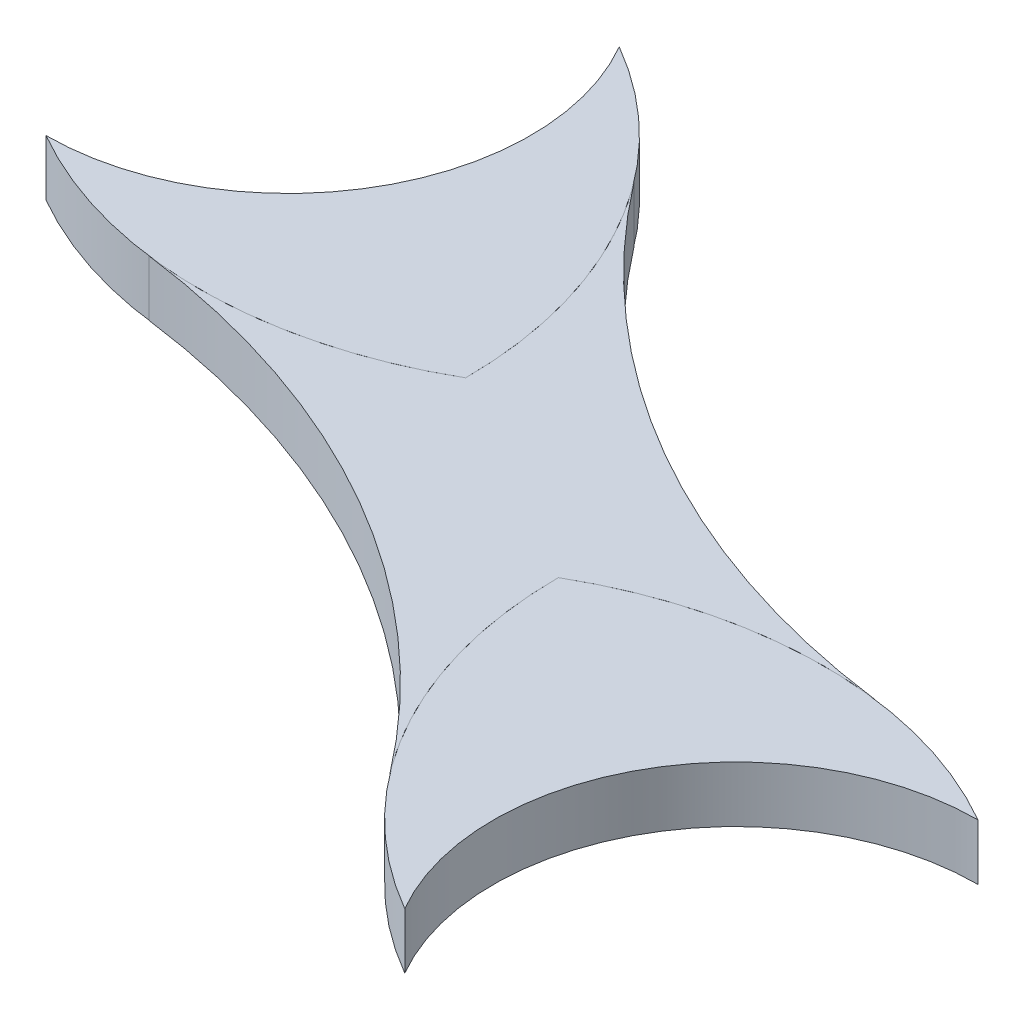
ISO-10303-21;
HEADER;
FILE_DESCRIPTION(('STEP AP214'),'2;1');
FILE_NAME('part.step','',(''),(''),'','','');
FILE_SCHEMA(('AUTOMOTIVE_DESIGN { 1 0 10303 214 1 1 1 1 }'));
ENDSEC;
DATA;
#1=APPLICATION_CONTEXT('core data for automotive mechanical design processes');
#2=APPLICATION_PROTOCOL_DEFINITION('international standard','automotive_design',2000,#1);
#3=PRODUCT_CONTEXT('',#1,'mechanical');
#4=PRODUCT('Part','Part','',(#3));
#5=PRODUCT_RELATED_PRODUCT_CATEGORY('part','',(#4));
#6=PRODUCT_DEFINITION_FORMATION('','',#4);
#7=PRODUCT_DEFINITION_CONTEXT('part definition',#1,'design');
#8=PRODUCT_DEFINITION('design','',#6,#7);
#9=PRODUCT_DEFINITION_SHAPE('','',#8);
#10=(LENGTH_UNIT() NAMED_UNIT(*) SI_UNIT(.MILLI.,.METRE.));
#11=(NAMED_UNIT(*) PLANE_ANGLE_UNIT() SI_UNIT($,.RADIAN.));
#12=(NAMED_UNIT(*) SI_UNIT($,.STERADIAN.) SOLID_ANGLE_UNIT());
#13=UNCERTAINTY_MEASURE_WITH_UNIT(LENGTH_MEASURE(1.E-05),#10,'distance_accuracy_value','');
#14=(GEOMETRIC_REPRESENTATION_CONTEXT(3) GLOBAL_UNCERTAINTY_ASSIGNED_CONTEXT((#13)) GLOBAL_UNIT_ASSIGNED_CONTEXT((#10,
#11,#12)) REPRESENTATION_CONTEXT('',''));
#15=CARTESIAN_POINT('',(0.,0.,0.));
#16=DIRECTION('',(0.,0.,1.));
#17=DIRECTION('',(1.,0.,0.));
#18=AXIS2_PLACEMENT_3D('',#15,#16,#17);
#19=CARTESIAN_POINT('',(646.423859707596,873.564193887283,1268.16700055433));
#20=DIRECTION('',(0.,1.,0.));
#21=DIRECTION('',(0.866025403784436,0.,-0.500000000000005));
#22=AXIS2_PLACEMENT_3D('',#19,#20,#21);
#23=CYLINDRICAL_SURFACE('',#22,22.5166604983954);
#24=DIRECTION('',(0.,1.,0.));
#25=VECTOR('',#24,1.);
#26=CARTESIAN_POINT('',(657.682189956793,873.564193887283,1287.66700055433));
#27=LINE('',#26,#25);
#28=CARTESIAN_POINT('',(657.682189956793,873.574193887283,1287.66700055433));
#29=VERTEX_POINT('',#28);
#30=CARTESIAN_POINT('',(657.682189956793,876.574193887283,1287.66700055433));
#31=VERTEX_POINT('',#30);
#32=EDGE_CURVE('E103',#29,#31,#27,.T.);
#33=ORIENTED_EDGE('',*,*,#32,.T.);
#34=CARTESIAN_POINT('',(646.423859707596,876.574193887283,1268.16700055433));
#35=DIRECTION('',(0.,1.,0.));
#36=DIRECTION('',(0.866025403784436,0.,-0.500000000000005));
#37=AXIS2_PLACEMENT_3D('',#34,#35,#36);
#38=CIRCLE('',#37,22.5166604983954);
#39=CARTESIAN_POINT('',(635.165529458398,876.574193887283,1287.66700055433));
#40=VERTEX_POINT('',#39);
#41=EDGE_CURVE('E79',#40,#31,#38,.T.);
#42=ORIENTED_EDGE('',*,*,#41,.F.);
#43=DIRECTION('',(0.,-1.,0.));
#44=VECTOR('',#43,1.);
#45=CARTESIAN_POINT('',(635.165529458398,876.574193887283,1287.66700055433));
#46=LINE('',#45,#44);
#47=CARTESIAN_POINT('',(635.165529458398,873.574193887283,1287.66700055433));
#48=VERTEX_POINT('',#47);
#49=EDGE_CURVE('E12',#40,#48,#46,.T.);
#50=ORIENTED_EDGE('',*,*,#49,.T.);
#51=CARTESIAN_POINT('',(646.423859707596,873.574193887283,1268.16700055433));
#52=DIRECTION('',(0.,1.,0.));
#53=DIRECTION('',(0.866025403784436,0.,-0.500000000000005));
#54=AXIS2_PLACEMENT_3D('',#51,#52,#53);
#55=CIRCLE('',#54,22.5166604983954);
#56=EDGE_CURVE('E86',#48,#29,#55,.T.);
#57=ORIENTED_EDGE('',*,*,#56,.T.);
#58=EDGE_LOOP('',(#33,#42,#50,#57));
#59=FACE_BOUND('',#58,.T.);
#60=ADVANCED_FACE('F62',(#59),#23,.T.);
#61=CARTESIAN_POINT('',(689.806545609775,873.574193887283,1243.11999517054));
#62=DIRECTION('',(0.,1.,0.));
#63=DIRECTION('',(0.866025403784436,0.,-0.500000000000005));
#64=AXIS2_PLACEMENT_3D('',#61,#62,#63);
#65=PLANE('',#64);
#66=CARTESIAN_POINT('',(635.165529458398,873.574193887283,1274.66700055433));
#67=DIRECTION('',(0.,-1.,0.));
#68=DIRECTION('',(-0.866025403784436,0.,0.500000000000005));
#69=AXIS2_PLACEMENT_3D('',#66,#67,#68);
#70=CIRCLE('',#69,13.);
#71=CARTESIAN_POINT('',(646.423859707596,873.574193887283,1268.16700055433));
#72=VERTEX_POINT('',#71);
#73=EDGE_CURVE('E104',#72,#48,#70,.T.);
#74=ORIENTED_EDGE('',*,*,#73,.F.);
#75=CARTESIAN_POINT('',(635.165529458398,873.574193887283,1287.66700055433));
#76=DIRECTION('',(0.,1.,0.));
#77=DIRECTION('',(0.866025403784436,0.,-0.500000000000005));
#78=AXIS2_PLACEMENT_3D('',#75,#76,#77);
#79=CIRCLE('',#78,22.5166604983954);
#80=EDGE_CURVE('E109',#29,#72,#79,.T.);
#81=ORIENTED_EDGE('',*,*,#80,.F.);
#82=ORIENTED_EDGE('',*,*,#56,.F.);
#83=EDGE_LOOP('',(#74,#81,#82));
#84=FACE_BOUND('',#83,.T.);
#85=ADVANCED_FACE('F64',(#84),#65,.F.);
#86=CARTESIAN_POINT('',(635.165529458398,873.564193887283,1287.66700055433));
#87=DIRECTION('',(0.,1.,0.));
#88=DIRECTION('',(0.866025403784436,0.,-0.500000000000005));
#89=AXIS2_PLACEMENT_3D('',#86,#87,#88);
#90=CYLINDRICAL_SURFACE('',#89,22.5166604983954);
#91=ORIENTED_EDGE('',*,*,#32,.F.);
#92=ORIENTED_EDGE('',*,*,#80,.T.);
#93=DIRECTION('',(0.,-1.,0.));
#94=VECTOR('',#93,1.);
#95=CARTESIAN_POINT('',(646.423859707596,876.574193887283,1268.16700055433));
#96=LINE('',#95,#94);
#97=CARTESIAN_POINT('',(646.423859707596,876.574193887283,1268.16700055433));
#98=VERTEX_POINT('',#97);
#99=EDGE_CURVE('E66',#98,#72,#96,.T.);
#100=ORIENTED_EDGE('',*,*,#99,.F.);
#101=CARTESIAN_POINT('',(635.165529458398,876.574193887283,1287.66700055433));
#102=DIRECTION('',(0.,1.,0.));
#103=DIRECTION('',(0.866025403784436,0.,-0.500000000000005));
#104=AXIS2_PLACEMENT_3D('',#101,#102,#103);
#105=CIRCLE('',#104,22.5166604983954);
#106=EDGE_CURVE('E71',#31,#98,#105,.T.);
#107=ORIENTED_EDGE('',*,*,#106,.F.);
#108=EDGE_LOOP('',(#91,#92,#100,#107));
#109=FACE_BOUND('',#108,.T.);
#110=ADVANCED_FACE('F117',(#109),#90,.T.);
#111=CARTESIAN_POINT('',(635.165529458398,861.564193887283,1274.66700055433));
#112=DIRECTION('',(0.,1.,0.));
#113=DIRECTION('',(0.866025403784436,0.,-0.500000000000005));
#114=AXIS2_PLACEMENT_3D('',#111,#112,#113);
#115=CYLINDRICAL_SURFACE('',#114,13.);
#116=ORIENTED_EDGE('',*,*,#49,.F.);
#117=CARTESIAN_POINT('',(635.165529458398,876.574193887283,1274.66700055433));
#118=DIRECTION('',(0.,1.,0.));
#119=DIRECTION('',(0.866025403784436,0.,-0.500000000000005));
#120=AXIS2_PLACEMENT_3D('',#117,#118,#119);
#121=CIRCLE('',#120,13.);
#122=EDGE_CURVE('E97',#40,#98,#121,.T.);
#123=ORIENTED_EDGE('',*,*,#122,.T.);
#124=ORIENTED_EDGE('',*,*,#99,.T.);
#125=ORIENTED_EDGE('',*,*,#73,.T.);
#126=EDGE_LOOP('',(#116,#123,#124,#125));
#127=FACE_BOUND('',#126,.T.);
#128=ADVANCED_FACE('F107',(#127),#115,.F.);
#129=CARTESIAN_POINT('',(689.806545609775,876.574193887283,1243.11999517054));
#130=DIRECTION('',(0.,1.,0.));
#131=DIRECTION('',(0.866025403784436,0.,-0.500000000000005));
#132=AXIS2_PLACEMENT_3D('',#129,#130,#131);
#133=PLANE('',#132);
#134=ORIENTED_EDGE('',*,*,#106,.T.);
#135=ORIENTED_EDGE('',*,*,#122,.F.);
#136=ORIENTED_EDGE('',*,*,#41,.T.);
#137=EDGE_LOOP('',(#134,#135,#136));
#138=FACE_BOUND('',#137,.T.);
#139=ADVANCED_FACE('F99',(#138),#133,.T.);
#140=CLOSED_SHELL('',(#60,#85,#110,#128,#139));
#141=MANIFOLD_SOLID_BREP('B2',#140);
#142=CARTESIAN_POINT('',(680.711031019824,873.564193887283,1313.9627081412));
#143=DIRECTION('',(0.,1.,0.));
#144=DIRECTION('',(-0.866025403784438,0.,0.500000000000001));
#145=AXIS2_PLACEMENT_3D('',#142,#143,#144);
#146=CYLINDRICAL_SURFACE('',#145,22.5166604983954);
#147=DIRECTION('',(0.,1.,0.));
#148=VECTOR('',#147,1.);
#149=CARTESIAN_POINT('',(669.452700770626,873.564193887283,1294.4627081412));
#150=LINE('',#149,#148);
#151=CARTESIAN_POINT('',(669.452700770626,873.574193887283,1294.4627081412));
#152=VERTEX_POINT('',#151);
#153=CARTESIAN_POINT('',(669.452700770626,876.574193887283,1294.4627081412));
#154=VERTEX_POINT('',#153);
#155=EDGE_CURVE('E261',#152,#154,#150,.T.);
#156=ORIENTED_EDGE('',*,*,#155,.T.);
#157=CARTESIAN_POINT('',(680.711031019824,876.574193887283,1313.9627081412));
#158=DIRECTION('',(0.,1.,0.));
#159=DIRECTION('',(-0.866025403784438,0.,0.500000000000001));
#160=AXIS2_PLACEMENT_3D('',#157,#158,#159);
#161=CIRCLE('',#160,22.5166604983954);
#162=CARTESIAN_POINT('',(691.969361269021,876.574193887283,1294.4627081412));
#163=VERTEX_POINT('',#162);
#164=EDGE_CURVE('E237',#163,#154,#161,.T.);
#165=ORIENTED_EDGE('',*,*,#164,.F.);
#166=DIRECTION('',(0.,-1.,0.));
#167=VECTOR('',#166,1.);
#168=CARTESIAN_POINT('',(691.969361269021,876.574193887283,1294.4627081412));
#169=LINE('',#168,#167);
#170=CARTESIAN_POINT('',(691.969361269021,873.574193887283,1294.4627081412));
#171=VERTEX_POINT('',#170);
#172=EDGE_CURVE('E60',#163,#171,#169,.T.);
#173=ORIENTED_EDGE('',*,*,#172,.T.);
#174=CARTESIAN_POINT('',(680.711031019824,873.574193887283,1313.9627081412));
#175=DIRECTION('',(0.,1.,0.));
#176=DIRECTION('',(-0.866025403784438,0.,0.500000000000001));
#177=AXIS2_PLACEMENT_3D('',#174,#175,#176);
#178=CIRCLE('',#177,22.5166604983954);
#179=EDGE_CURVE('E244',#171,#152,#178,.T.);
#180=ORIENTED_EDGE('',*,*,#179,.T.);
#181=EDGE_LOOP('',(#156,#165,#173,#180));
#182=FACE_BOUND('',#181,.T.);
#183=ADVANCED_FACE('F220',(#182),#146,.T.);
#184=CARTESIAN_POINT('',(637.328345117644,873.574193887283,1339.00971352499));
#185=DIRECTION('',(0.,1.,0.));
#186=DIRECTION('',(-0.866025403784438,0.,0.500000000000001));
#187=AXIS2_PLACEMENT_3D('',#184,#185,#186);
#188=PLANE('',#187);
#189=CARTESIAN_POINT('',(691.969361269021,873.574193887283,1307.4627081412));
#190=DIRECTION('',(0.,-1.,0.));
#191=DIRECTION('',(0.866025403784438,0.,-0.500000000000001));
#192=AXIS2_PLACEMENT_3D('',#189,#190,#191);
#193=CIRCLE('',#192,13.);
#194=CARTESIAN_POINT('',(680.711031019824,873.574193887283,1313.9627081412));
#195=VERTEX_POINT('',#194);
#196=EDGE_CURVE('E262',#195,#171,#193,.T.);
#197=ORIENTED_EDGE('',*,*,#196,.F.);
#198=CARTESIAN_POINT('',(691.969361269021,873.574193887283,1294.4627081412));
#199=DIRECTION('',(0.,1.,0.));
#200=DIRECTION('',(-0.866025403784438,0.,0.500000000000001));
#201=AXIS2_PLACEMENT_3D('',#198,#199,#200);
#202=CIRCLE('',#201,22.5166604983954);
#203=EDGE_CURVE('E267',#152,#195,#202,.T.);
#204=ORIENTED_EDGE('',*,*,#203,.F.);
#205=ORIENTED_EDGE('',*,*,#179,.F.);
#206=EDGE_LOOP('',(#197,#204,#205));
#207=FACE_BOUND('',#206,.T.);
#208=ADVANCED_FACE('F222',(#207),#188,.F.);
#209=CARTESIAN_POINT('',(691.969361269021,873.564193887283,1294.4627081412));
#210=DIRECTION('',(0.,1.,0.));
#211=DIRECTION('',(-0.866025403784438,0.,0.500000000000001));
#212=AXIS2_PLACEMENT_3D('',#209,#210,#211);
#213=CYLINDRICAL_SURFACE('',#212,22.5166604983954);
#214=ORIENTED_EDGE('',*,*,#155,.F.);
#215=ORIENTED_EDGE('',*,*,#203,.T.);
#216=DIRECTION('',(0.,-1.,0.));
#217=VECTOR('',#216,1.);
#218=CARTESIAN_POINT('',(680.711031019824,876.574193887283,1313.9627081412));
#219=LINE('',#218,#217);
#220=CARTESIAN_POINT('',(680.711031019824,876.574193887283,1313.9627081412));
#221=VERTEX_POINT('',#220);
#222=EDGE_CURVE('E224',#221,#195,#219,.T.);
#223=ORIENTED_EDGE('',*,*,#222,.F.);
#224=CARTESIAN_POINT('',(691.969361269021,876.574193887283,1294.4627081412));
#225=DIRECTION('',(0.,1.,0.));
#226=DIRECTION('',(-0.866025403784438,0.,0.500000000000001));
#227=AXIS2_PLACEMENT_3D('',#224,#225,#226);
#228=CIRCLE('',#227,22.5166604983954);
#229=EDGE_CURVE('E229',#154,#221,#228,.T.);
#230=ORIENTED_EDGE('',*,*,#229,.F.);
#231=EDGE_LOOP('',(#214,#215,#223,#230));
#232=FACE_BOUND('',#231,.T.);
#233=ADVANCED_FACE('F275',(#232),#213,.T.);
#234=CARTESIAN_POINT('',(691.969361269021,861.564193887283,1307.4627081412));
#235=DIRECTION('',(0.,1.,0.));
#236=DIRECTION('',(-0.866025403784438,0.,0.500000000000001));
#237=AXIS2_PLACEMENT_3D('',#234,#235,#236);
#238=CYLINDRICAL_SURFACE('',#237,13.);
#239=ORIENTED_EDGE('',*,*,#172,.F.);
#240=CARTESIAN_POINT('',(691.969361269021,876.574193887283,1307.4627081412));
#241=DIRECTION('',(0.,1.,0.));
#242=DIRECTION('',(-0.866025403784438,0.,0.500000000000001));
#243=AXIS2_PLACEMENT_3D('',#240,#241,#242);
#244=CIRCLE('',#243,13.);
#245=EDGE_CURVE('E255',#163,#221,#244,.T.);
#246=ORIENTED_EDGE('',*,*,#245,.T.);
#247=ORIENTED_EDGE('',*,*,#222,.T.);
#248=ORIENTED_EDGE('',*,*,#196,.T.);
#249=EDGE_LOOP('',(#239,#246,#247,#248));
#250=FACE_BOUND('',#249,.T.);
#251=ADVANCED_FACE('F265',(#250),#238,.F.);
#252=CARTESIAN_POINT('',(637.328345117644,876.574193887283,1339.00971352499));
#253=DIRECTION('',(0.,1.,0.));
#254=DIRECTION('',(-0.866025403784438,0.,0.500000000000001));
#255=AXIS2_PLACEMENT_3D('',#252,#253,#254);
#256=PLANE('',#255);
#257=ORIENTED_EDGE('',*,*,#229,.T.);
#258=ORIENTED_EDGE('',*,*,#245,.F.);
#259=ORIENTED_EDGE('',*,*,#164,.T.);
#260=EDGE_LOOP('',(#257,#258,#259));
#261=FACE_BOUND('',#260,.T.);
#262=ADVANCED_FACE('F257',(#261),#256,.T.);
#263=CLOSED_SHELL('',(#183,#208,#233,#251,#262));
#264=MANIFOLD_SOLID_BREP('B6',#263);
#265=CARTESIAN_POINT('',(635.165529458392,873.564193887283,1287.66700055434));
#266=DIRECTION('',(0.,1.,0.));
#267=DIRECTION('',(0.,0.,1.));
#268=AXIS2_PLACEMENT_3D('',#265,#266,#267);
#269=CYLINDRICAL_SURFACE('',#268,22.5166604983954);
#270=CARTESIAN_POINT('',(635.165529458392,873.574193887283,1287.66700055434));
#271=DIRECTION('',(0.,1.,0.));
#272=DIRECTION('',(0.,0.,1.));
#273=AXIS2_PLACEMENT_3D('',#270,#271,#272);
#274=CIRCLE('',#273,22.5166604983954);
#275=CARTESIAN_POINT('',(657.682189956788,873.574193887283,1287.66700055434));
#276=VERTEX_POINT('',#275);
#277=CARTESIAN_POINT('',(653.057023230417,873.574193887283,1273.99606603596));
#278=VERTEX_POINT('',#277);
#279=EDGE_CURVE('E429',#276,#278,#274,.T.);
#280=ORIENTED_EDGE('',*,*,#279,.F.);
#281=DIRECTION('',(0.,1.,0.));
#282=VECTOR('',#281,1.);
#283=CARTESIAN_POINT('',(657.682189956788,873.564193887283,1287.66700055434));
#284=LINE('',#283,#282);
#285=CARTESIAN_POINT('',(657.682189956788,876.574193887283,1287.66700055434));
#286=VERTEX_POINT('',#285);
#287=EDGE_CURVE('E373',#276,#286,#284,.T.);
#288=ORIENTED_EDGE('',*,*,#287,.T.);
#289=CARTESIAN_POINT('',(635.165529458392,876.574193887283,1287.66700055434));
#290=DIRECTION('',(0.,1.,0.));
#291=DIRECTION('',(0.,0.,1.));
#292=AXIS2_PLACEMENT_3D('',#289,#290,#291);
#293=CIRCLE('',#292,22.5166604983954);
#294=CARTESIAN_POINT('',(653.057023230417,876.574193887283,1273.99606603596));
#295=VERTEX_POINT('',#294);
#296=EDGE_CURVE('E481',#286,#295,#293,.T.);
#297=ORIENTED_EDGE('',*,*,#296,.T.);
#298=DIRECTION('',(0.,-1.,0.));
#299=VECTOR('',#298,1.);
#300=CARTESIAN_POINT('',(653.057023230417,876.574193887283,1273.99606603596));
#301=LINE('',#300,#299);
#302=EDGE_CURVE('E484',#295,#278,#301,.T.);
#303=ORIENTED_EDGE('',*,*,#302,.T.);
#304=EDGE_LOOP('',(#280,#288,#297,#303));
#305=FACE_BOUND('',#304,.T.);
#306=ADVANCED_FACE('F369',(#305),#269,.F.);
#307=CARTESIAN_POINT('',(646.42385970759,873.564193887283,1268.16700055434));
#308=DIRECTION('',(0.,1.,0.));
#309=DIRECTION('',(0.,0.,1.));
#310=AXIS2_PLACEMENT_3D('',#307,#308,#309);
#311=CYLINDRICAL_SURFACE('',#310,22.5166604983954);
#312=DIRECTION('',(0.,-1.,0.));
#313=VECTOR('',#312,1.);
#314=CARTESIAN_POINT('',(643.530230007219,876.574193887283,1290.49695593175));
#315=LINE('',#314,#313);
#316=CARTESIAN_POINT('',(643.530230007219,876.574193887283,1290.49695593175));
#317=VERTEX_POINT('',#316);
#318=CARTESIAN_POINT('',(643.530230007219,873.574193887283,1290.49695593175));
#319=VERTEX_POINT('',#318);
#320=EDGE_CURVE('E471',#317,#319,#315,.T.);
#321=ORIENTED_EDGE('',*,*,#320,.F.);
#322=CARTESIAN_POINT('',(646.42385970759,876.574193887283,1268.16700055434));
#323=DIRECTION('',(0.,1.,0.));
#324=DIRECTION('',(0.,0.,1.));
#325=AXIS2_PLACEMENT_3D('',#322,#323,#324);
#326=CIRCLE('',#325,22.5166604983954);
#327=EDGE_CURVE('E468',#317,#286,#326,.T.);
#328=ORIENTED_EDGE('',*,*,#327,.T.);
#329=ORIENTED_EDGE('',*,*,#287,.F.);
#330=CARTESIAN_POINT('',(646.42385970759,873.574193887283,1268.16700055434));
#331=DIRECTION('',(0.,1.,0.));
#332=DIRECTION('',(0.,0.,1.));
#333=AXIS2_PLACEMENT_3D('',#330,#331,#332);
#334=CIRCLE('',#333,22.5166604983954);
#335=EDGE_CURVE('E387',#319,#276,#334,.T.);
#336=ORIENTED_EDGE('',*,*,#335,.F.);
#337=EDGE_LOOP('',(#321,#328,#329,#336));
#338=FACE_BOUND('',#337,.T.);
#339=ADVANCED_FACE('F489',(#338),#311,.F.);
#340=CARTESIAN_POINT('',(689.498403368761,876.574193887283,1246.15111759407));
#341=DIRECTION('',(0.,-1.,0.));
#342=DIRECTION('',(0.,0.,-1.));
#343=AXIS2_PLACEMENT_3D('',#340,#341,#342);
#344=CYLINDRICAL_SURFACE('',#343,45.8619160101144);
#345=CARTESIAN_POINT('',(689.498403368761,876.574193887283,1246.15111759407));
#346=DIRECTION('',(0.,1.,0.));
#347=DIRECTION('',(0.,0.,1.));
#348=AXIS2_PLACEMENT_3D('',#345,#346,#347);
#349=CIRCLE('',#348,45.8619160101144);
#350=CARTESIAN_POINT('',(683.604660720189,876.574193887283,1291.63275276379));
#351=VERTEX_POINT('',#350);
#352=EDGE_CURVE('E438',#295,#351,#349,.T.);
#353=ORIENTED_EDGE('',*,*,#352,.T.);
#354=DIRECTION('',(0.,-1.,0.));
#355=VECTOR('',#354,1.);
#356=CARTESIAN_POINT('',(683.604660720189,876.574193887283,1291.63275276379));
#357=LINE('',#356,#355);
#358=CARTESIAN_POINT('',(683.604660720189,873.574193887283,1291.63275276379));
#359=VERTEX_POINT('',#358);
#360=EDGE_CURVE('E435',#351,#359,#357,.T.);
#361=ORIENTED_EDGE('',*,*,#360,.T.);
#362=CARTESIAN_POINT('',(689.498403368761,873.574193887283,1246.15111759407));
#363=DIRECTION('',(0.,1.,0.));
#364=DIRECTION('',(0.,0.,1.));
#365=AXIS2_PLACEMENT_3D('',#362,#363,#364);
#366=CIRCLE('',#365,45.8619160101144);
#367=EDGE_CURVE('E380',#278,#359,#366,.T.);
#368=ORIENTED_EDGE('',*,*,#367,.F.);
#369=ORIENTED_EDGE('',*,*,#302,.F.);
#370=EDGE_LOOP('',(#353,#361,#368,#369));
#371=FACE_BOUND('',#370,.T.);
#372=ADVANCED_FACE('F436',(#371),#344,.F.);
#373=CARTESIAN_POINT('',(637.636487358646,876.574193887283,1335.97859110146));
#374=DIRECTION('',(0.,-1.,0.));
#375=DIRECTION('',(0.,0.,-1.));
#376=AXIS2_PLACEMENT_3D('',#373,#374,#375);
#377=CYLINDRICAL_SURFACE('',#376,45.8619160101144);
#378=CARTESIAN_POINT('',(637.636487358646,873.574193887283,1335.97859110146));
#379=DIRECTION('',(0.,1.,0.));
#380=DIRECTION('',(0.,0.,1.));
#381=AXIS2_PLACEMENT_3D('',#378,#379,#380);
#382=CIRCLE('',#381,45.8619160101144);
#383=CARTESIAN_POINT('',(674.077867496991,873.574193887283,1308.13364265957));
#384=VERTEX_POINT('',#383);
#385=EDGE_CURVE('E218',#319,#384,#382,.F.);
#386=ORIENTED_EDGE('',*,*,#385,.T.);
#387=DIRECTION('',(0.,-1.,0.));
#388=VECTOR('',#387,1.);
#389=CARTESIAN_POINT('',(674.077867496991,876.574193887283,1308.13364265957));
#390=LINE('',#389,#388);
#391=CARTESIAN_POINT('',(674.077867496991,876.574193887283,1308.13364265957));
#392=VERTEX_POINT('',#391);
#393=EDGE_CURVE('E450',#392,#384,#390,.T.);
#394=ORIENTED_EDGE('',*,*,#393,.F.);
#395=CARTESIAN_POINT('',(637.636487358646,876.574193887283,1335.97859110146));
#396=DIRECTION('',(0.,1.,0.));
#397=DIRECTION('',(0.,0.,1.));
#398=AXIS2_PLACEMENT_3D('',#395,#396,#397);
#399=CIRCLE('',#398,45.8619160101144);
#400=EDGE_CURVE('E432',#317,#392,#399,.F.);
#401=ORIENTED_EDGE('',*,*,#400,.F.);
#402=ORIENTED_EDGE('',*,*,#320,.T.);
#403=EDGE_LOOP('',(#386,#394,#401,#402));
#404=FACE_BOUND('',#403,.T.);
#405=ADVANCED_FACE('F497',(#404),#377,.F.);
#406=CARTESIAN_POINT('',(635.165529458392,873.574193887283,1337.76101132192));
#407=DIRECTION('',(0.,1.,0.));
#408=DIRECTION('',(0.,0.,1.));
#409=AXIS2_PLACEMENT_3D('',#406,#407,#408);
#410=PLANE('',#409);
#411=ORIENTED_EDGE('',*,*,#385,.F.);
#412=ORIENTED_EDGE('',*,*,#335,.T.);
#413=ORIENTED_EDGE('',*,*,#279,.T.);
#414=ORIENTED_EDGE('',*,*,#367,.T.);
#415=CARTESIAN_POINT('',(680.711031019817,873.574193887283,1313.9627081412));
#416=DIRECTION('',(0.,-1.,0.));
#417=DIRECTION('',(-0.866025403784438,0.,0.500000000000001));
#418=AXIS2_PLACEMENT_3D('',#415,#416,#417);
#419=CIRCLE('',#418,22.5166604983954);
#420=CARTESIAN_POINT('',(669.45270077062,873.574193887283,1294.4627081412));
#421=VERTEX_POINT('',#420);
#422=EDGE_CURVE('E428',#421,#359,#419,.T.);
#423=ORIENTED_EDGE('',*,*,#422,.F.);
#424=CARTESIAN_POINT('',(691.969361269015,873.574193887283,1294.4627081412));
#425=DIRECTION('',(0.,-1.,0.));
#426=DIRECTION('',(-0.866025403784438,0.,0.500000000000001));
#427=AXIS2_PLACEMENT_3D('',#424,#425,#426);
#428=CIRCLE('',#427,22.5166604983954);
#429=EDGE_CURVE('E451',#384,#421,#428,.T.);
#430=ORIENTED_EDGE('',*,*,#429,.F.);
#431=EDGE_LOOP('',(#411,#412,#413,#414,#423,#430));
#432=FACE_BOUND('',#431,.T.);
#433=ADVANCED_FACE('F425',(#432),#410,.F.);
#434=CARTESIAN_POINT('',(635.165529458392,876.574193887283,1337.76101132192));
#435=DIRECTION('',(0.,1.,0.));
#436=DIRECTION('',(0.,0.,1.));
#437=AXIS2_PLACEMENT_3D('',#434,#435,#436);
#438=PLANE('',#437);
#439=ORIENTED_EDGE('',*,*,#327,.F.);
#440=ORIENTED_EDGE('',*,*,#400,.T.);
#441=CARTESIAN_POINT('',(691.969361269015,876.574193887283,1294.4627081412));
#442=DIRECTION('',(0.,-1.,0.));
#443=DIRECTION('',(-0.866025403784438,0.,0.500000000000001));
#444=AXIS2_PLACEMENT_3D('',#441,#442,#443);
#445=CIRCLE('',#444,22.5166604983954);
#446=CARTESIAN_POINT('',(669.45270077062,876.574193887283,1294.4627081412));
#447=VERTEX_POINT('',#446);
#448=EDGE_CURVE('E457',#392,#447,#445,.T.);
#449=ORIENTED_EDGE('',*,*,#448,.T.);
#450=CARTESIAN_POINT('',(680.711031019817,876.574193887283,1313.9627081412));
#451=DIRECTION('',(0.,-1.,0.));
#452=DIRECTION('',(-0.866025403784438,0.,0.500000000000001));
#453=AXIS2_PLACEMENT_3D('',#450,#451,#452);
#454=CIRCLE('',#453,22.5166604983954);
#455=EDGE_CURVE('E443',#447,#351,#454,.T.);
#456=ORIENTED_EDGE('',*,*,#455,.T.);
#457=ORIENTED_EDGE('',*,*,#352,.F.);
#458=ORIENTED_EDGE('',*,*,#296,.F.);
#459=EDGE_LOOP('',(#439,#440,#449,#456,#457,#458));
#460=FACE_BOUND('',#459,.T.);
#461=ADVANCED_FACE('F371',(#460),#438,.T.);
#462=CARTESIAN_POINT('',(680.711031019817,873.564193887283,1313.9627081412));
#463=DIRECTION('',(0.,1.,0.));
#464=DIRECTION('',(-0.866025403784438,0.,0.500000000000001));
#465=AXIS2_PLACEMENT_3D('',#462,#463,#464);
#466=CYLINDRICAL_SURFACE('',#465,22.5166604983954);
#467=ORIENTED_EDGE('',*,*,#422,.T.);
#468=ORIENTED_EDGE('',*,*,#360,.F.);
#469=ORIENTED_EDGE('',*,*,#455,.F.);
#470=DIRECTION('',(0.,1.,0.));
#471=VECTOR('',#470,1.);
#472=CARTESIAN_POINT('',(669.45270077062,873.564193887283,1294.4627081412));
#473=LINE('',#472,#471);
#474=EDGE_CURVE('E444',#421,#447,#473,.T.);
#475=ORIENTED_EDGE('',*,*,#474,.F.);
#476=EDGE_LOOP('',(#467,#468,#469,#475));
#477=FACE_BOUND('',#476,.T.);
#478=ADVANCED_FACE('F447',(#477),#466,.F.);
#479=CARTESIAN_POINT('',(691.969361269015,873.564193887283,1294.4627081412));
#480=DIRECTION('',(0.,1.,0.));
#481=DIRECTION('',(-0.866025403784438,0.,0.500000000000001));
#482=AXIS2_PLACEMENT_3D('',#479,#480,#481);
#483=CYLINDRICAL_SURFACE('',#482,22.5166604983954);
#484=ORIENTED_EDGE('',*,*,#393,.T.);
#485=ORIENTED_EDGE('',*,*,#429,.T.);
#486=ORIENTED_EDGE('',*,*,#474,.T.);
#487=ORIENTED_EDGE('',*,*,#448,.F.);
#488=EDGE_LOOP('',(#484,#485,#486,#487));
#489=FACE_BOUND('',#488,.T.);
#490=ADVANCED_FACE('F495',(#489),#483,.F.);
#491=CLOSED_SHELL('',(#306,#339,#372,#405,#433,#461,#478,#490));
#492=MANIFOLD_SOLID_BREP('B54',#491);
#493=ADVANCED_BREP_SHAPE_REPRESENTATION('',(#18,#141,#264,#492),#14);
#494=SHAPE_DEFINITION_REPRESENTATION(#9,#493);
ENDSEC;
END-ISO-10303-21;
